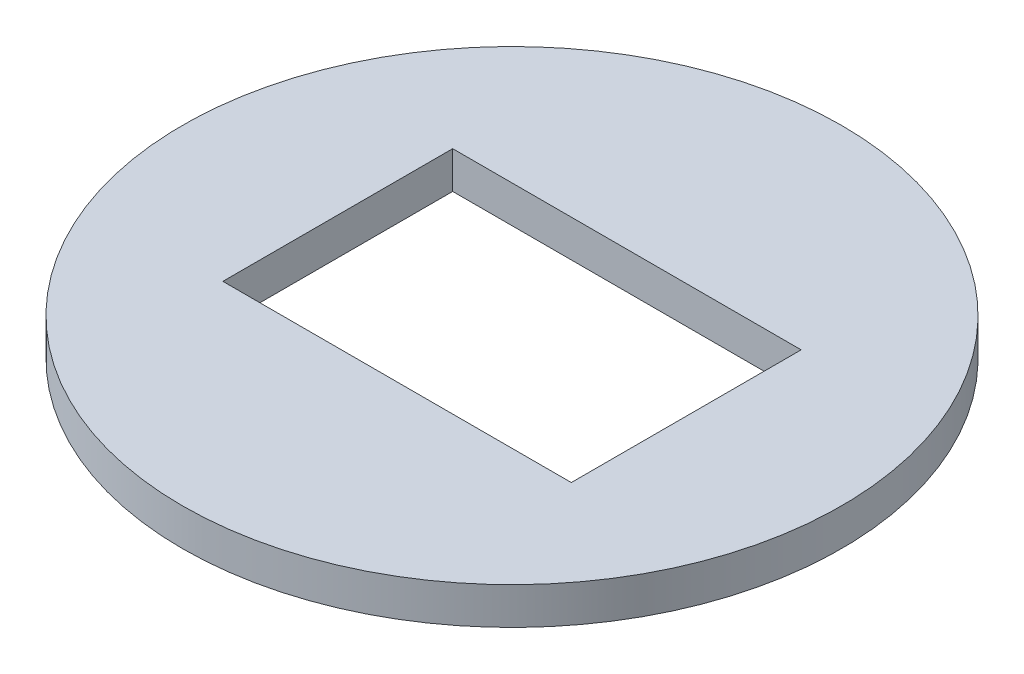
ISO-10303-21;
HEADER;
FILE_DESCRIPTION(('STEP AP214'),'2;1');
FILE_NAME('part.step','',(''),(''),'','','');
FILE_SCHEMA(('AUTOMOTIVE_DESIGN { 1 0 10303 214 1 1 1 1 }'));
ENDSEC;
DATA;
#1=APPLICATION_CONTEXT('core data for automotive mechanical design processes');
#2=APPLICATION_PROTOCOL_DEFINITION('international standard','automotive_design',2000,#1);
#3=PRODUCT_CONTEXT('',#1,'mechanical');
#4=PRODUCT('Part','Part','',(#3));
#5=PRODUCT_RELATED_PRODUCT_CATEGORY('part','',(#4));
#6=PRODUCT_DEFINITION_FORMATION('','',#4);
#7=PRODUCT_DEFINITION_CONTEXT('part definition',#1,'design');
#8=PRODUCT_DEFINITION('design','',#6,#7);
#9=PRODUCT_DEFINITION_SHAPE('','',#8);
#10=(LENGTH_UNIT() NAMED_UNIT(*) SI_UNIT(.MILLI.,.METRE.));
#11=(NAMED_UNIT(*) PLANE_ANGLE_UNIT() SI_UNIT($,.RADIAN.));
#12=(NAMED_UNIT(*) SI_UNIT($,.STERADIAN.) SOLID_ANGLE_UNIT());
#13=UNCERTAINTY_MEASURE_WITH_UNIT(LENGTH_MEASURE(1.E-05),#10,'distance_accuracy_value','');
#14=(GEOMETRIC_REPRESENTATION_CONTEXT(3) GLOBAL_UNCERTAINTY_ASSIGNED_CONTEXT((#13)) GLOBAL_UNIT_ASSIGNED_CONTEXT((#10,
#11,#12)) REPRESENTATION_CONTEXT('',''));
#15=CARTESIAN_POINT('',(0.,0.,0.));
#16=DIRECTION('',(0.,0.,1.));
#17=DIRECTION('',(1.,0.,0.));
#18=AXIS2_PLACEMENT_3D('',#15,#16,#17);
#19=CARTESIAN_POINT('',(0.,10.,0.));
#20=DIRECTION('',(0.,-1.,0.));
#21=DIRECTION('',(0.,0.,-1.));
#22=AXIS2_PLACEMENT_3D('',#19,#20,#21);
#23=CYLINDRICAL_SURFACE('',#22,88.9);
#24=CARTESIAN_POINT('',(0.,10.,0.));
#25=DIRECTION('',(0.,1.,0.));
#26=DIRECTION('',(0.,0.,1.));
#27=AXIS2_PLACEMENT_3D('',#24,#25,#26);
#28=CIRCLE('',#27,88.9);
#29=CARTESIAN_POINT('',(0.,10.,88.9));
#30=VERTEX_POINT('',#29);
#31=EDGE_CURVE('E91',#30,#30,#28,.T.);
#32=ORIENTED_EDGE('',*,*,#31,.F.);
#33=EDGE_LOOP('',(#32));
#34=FACE_BOUND('',#33,.T.);
#35=CARTESIAN_POINT('',(0.,0.,0.));
#36=DIRECTION('',(0.,1.,0.));
#37=DIRECTION('',(0.,0.,1.));
#38=AXIS2_PLACEMENT_3D('',#35,#36,#37);
#39=CIRCLE('',#38,88.9);
#40=CARTESIAN_POINT('',(0.,0.,88.9));
#41=VERTEX_POINT('',#40);
#42=EDGE_CURVE('E88',#41,#41,#39,.T.);
#43=ORIENTED_EDGE('',*,*,#42,.T.);
#44=EDGE_LOOP('',(#43));
#45=FACE_BOUND('',#44,.T.);
#46=ADVANCED_FACE('F32',(#34,#45),#23,.T.);
#47=CARTESIAN_POINT('',(0.,10.,0.));
#48=DIRECTION('',(0.,1.,0.));
#49=DIRECTION('',(0.,0.,1.));
#50=AXIS2_PLACEMENT_3D('',#47,#48,#49);
#51=PLANE('',#50);
#52=DIRECTION('',(0.,0.,-1.));
#53=VECTOR('',#52,1.);
#54=CARTESIAN_POINT('',(47.,10.,0.));
#55=LINE('',#54,#53);
#56=CARTESIAN_POINT('',(47.,10.,31.));
#57=VERTEX_POINT('',#56);
#58=CARTESIAN_POINT('',(47.,10.,-31.));
#59=VERTEX_POINT('',#58);
#60=EDGE_CURVE('E80',#57,#59,#55,.T.);
#61=ORIENTED_EDGE('',*,*,#60,.F.);
#62=DIRECTION('',(1.,0.,0.));
#63=VECTOR('',#62,1.);
#64=CARTESIAN_POINT('',(0.,10.,31.));
#65=LINE('',#64,#63);
#66=CARTESIAN_POINT('',(-47.,10.,31.));
#67=VERTEX_POINT('',#66);
#68=EDGE_CURVE('E69',#67,#57,#65,.T.);
#69=ORIENTED_EDGE('',*,*,#68,.F.);
#70=DIRECTION('',(0.,0.,1.));
#71=VECTOR('',#70,1.);
#72=CARTESIAN_POINT('',(-47.,10.,0.));
#73=LINE('',#72,#71);
#74=CARTESIAN_POINT('',(-47.,10.,-31.));
#75=VERTEX_POINT('',#74);
#76=EDGE_CURVE('E74',#75,#67,#73,.T.);
#77=ORIENTED_EDGE('',*,*,#76,.F.);
#78=DIRECTION('',(-1.,0.,0.));
#79=VECTOR('',#78,1.);
#80=CARTESIAN_POINT('',(0.,10.,-31.));
#81=LINE('',#80,#79);
#82=EDGE_CURVE('E87',#59,#75,#81,.T.);
#83=ORIENTED_EDGE('',*,*,#82,.F.);
#84=EDGE_LOOP('',(#61,#69,#77,#83));
#85=FACE_BOUND('',#84,.T.);
#86=ORIENTED_EDGE('',*,*,#31,.T.);
#87=EDGE_LOOP('',(#86));
#88=FACE_BOUND('',#87,.T.);
#89=ADVANCED_FACE('F85',(#85,#88),#51,.T.);
#90=CARTESIAN_POINT('',(0.,0.,0.));
#91=DIRECTION('',(0.,1.,0.));
#92=DIRECTION('',(0.,0.,1.));
#93=AXIS2_PLACEMENT_3D('',#90,#91,#92);
#94=PLANE('',#93);
#95=DIRECTION('',(1.,0.,0.));
#96=VECTOR('',#95,1.);
#97=CARTESIAN_POINT('',(0.,0.,31.));
#98=LINE('',#97,#96);
#99=CARTESIAN_POINT('',(-47.,0.,31.));
#100=VERTEX_POINT('',#99);
#101=CARTESIAN_POINT('',(47.,0.,31.));
#102=VERTEX_POINT('',#101);
#103=EDGE_CURVE('E97',#100,#102,#98,.T.);
#104=ORIENTED_EDGE('',*,*,#103,.T.);
#105=DIRECTION('',(0.,0.,-1.));
#106=VECTOR('',#105,1.);
#107=CARTESIAN_POINT('',(47.,0.,0.));
#108=LINE('',#107,#106);
#109=CARTESIAN_POINT('',(47.,0.,-31.));
#110=VERTEX_POINT('',#109);
#111=EDGE_CURVE('E11',#102,#110,#108,.T.);
#112=ORIENTED_EDGE('',*,*,#111,.T.);
#113=DIRECTION('',(-1.,0.,0.));
#114=VECTOR('',#113,1.);
#115=CARTESIAN_POINT('',(0.,0.,-31.));
#116=LINE('',#115,#114);
#117=CARTESIAN_POINT('',(-47.,0.,-31.));
#118=VERTEX_POINT('',#117);
#119=EDGE_CURVE('E39',#110,#118,#116,.T.);
#120=ORIENTED_EDGE('',*,*,#119,.T.);
#121=DIRECTION('',(0.,0.,1.));
#122=VECTOR('',#121,1.);
#123=CARTESIAN_POINT('',(-47.,0.,0.));
#124=LINE('',#123,#122);
#125=EDGE_CURVE('E100',#118,#100,#124,.T.);
#126=ORIENTED_EDGE('',*,*,#125,.T.);
#127=EDGE_LOOP('',(#104,#112,#120,#126));
#128=FACE_BOUND('',#127,.T.);
#129=ORIENTED_EDGE('',*,*,#42,.F.);
#130=EDGE_LOOP('',(#129));
#131=FACE_BOUND('',#130,.T.);
#132=ADVANCED_FACE('F104',(#128,#131),#94,.F.);
#133=CARTESIAN_POINT('',(47.,20.,31.));
#134=DIRECTION('',(1.,0.,0.));
#135=DIRECTION('',(0.,0.,-1.));
#136=AXIS2_PLACEMENT_3D('',#133,#134,#135);
#137=PLANE('',#136);
#138=ORIENTED_EDGE('',*,*,#60,.T.);
#139=DIRECTION('',(0.,-1.,0.));
#140=VECTOR('',#139,1.);
#141=CARTESIAN_POINT('',(47.,20.,-31.));
#142=LINE('',#141,#140);
#143=EDGE_CURVE('E75',#59,#110,#142,.T.);
#144=ORIENTED_EDGE('',*,*,#143,.T.);
#145=ORIENTED_EDGE('',*,*,#111,.F.);
#146=DIRECTION('',(0.,-1.,0.));
#147=VECTOR('',#146,1.);
#148=CARTESIAN_POINT('',(47.,20.,31.));
#149=LINE('',#148,#147);
#150=EDGE_CURVE('E51',#57,#102,#149,.T.);
#151=ORIENTED_EDGE('',*,*,#150,.F.);
#152=EDGE_LOOP('',(#138,#144,#145,#151));
#153=FACE_BOUND('',#152,.T.);
#154=ADVANCED_FACE('F78',(#153),#137,.F.);
#155=CARTESIAN_POINT('',(-47.,20.,-31.));
#156=DIRECTION('',(0.,0.,-1.));
#157=DIRECTION('',(-1.,0.,0.));
#158=AXIS2_PLACEMENT_3D('',#155,#156,#157);
#159=PLANE('',#158);
#160=ORIENTED_EDGE('',*,*,#82,.T.);
#161=DIRECTION('',(0.,-1.,0.));
#162=VECTOR('',#161,1.);
#163=CARTESIAN_POINT('',(-47.,20.,-31.));
#164=LINE('',#163,#162);
#165=EDGE_CURVE('E110',#75,#118,#164,.T.);
#166=ORIENTED_EDGE('',*,*,#165,.T.);
#167=ORIENTED_EDGE('',*,*,#119,.F.);
#168=ORIENTED_EDGE('',*,*,#143,.F.);
#169=EDGE_LOOP('',(#160,#166,#167,#168));
#170=FACE_BOUND('',#169,.T.);
#171=ADVANCED_FACE('F108',(#170),#159,.F.);
#172=CARTESIAN_POINT('',(-47.,20.,31.));
#173=DIRECTION('',(-1.,0.,0.));
#174=DIRECTION('',(0.,0.,1.));
#175=AXIS2_PLACEMENT_3D('',#172,#173,#174);
#176=PLANE('',#175);
#177=ORIENTED_EDGE('',*,*,#76,.T.);
#178=DIRECTION('',(0.,-1.,0.));
#179=VECTOR('',#178,1.);
#180=CARTESIAN_POINT('',(-47.,20.,31.));
#181=LINE('',#180,#179);
#182=EDGE_CURVE('E46',#67,#100,#181,.T.);
#183=ORIENTED_EDGE('',*,*,#182,.T.);
#184=ORIENTED_EDGE('',*,*,#125,.F.);
#185=ORIENTED_EDGE('',*,*,#165,.F.);
#186=EDGE_LOOP('',(#177,#183,#184,#185));
#187=FACE_BOUND('',#186,.T.);
#188=ADVANCED_FACE('F115',(#187),#176,.F.);
#189=CARTESIAN_POINT('',(-47.,20.,31.));
#190=DIRECTION('',(0.,0.,1.));
#191=DIRECTION('',(1.,0.,0.));
#192=AXIS2_PLACEMENT_3D('',#189,#190,#191);
#193=PLANE('',#192);
#194=ORIENTED_EDGE('',*,*,#68,.T.);
#195=ORIENTED_EDGE('',*,*,#150,.T.);
#196=ORIENTED_EDGE('',*,*,#103,.F.);
#197=ORIENTED_EDGE('',*,*,#182,.F.);
#198=EDGE_LOOP('',(#194,#195,#196,#197));
#199=FACE_BOUND('',#198,.T.);
#200=ADVANCED_FACE('F70',(#199),#193,.F.);
#201=CLOSED_SHELL('',(#46,#89,#132,#154,#171,#188,#200));
#202=MANIFOLD_SOLID_BREP('B2',#201);
#203=ADVANCED_BREP_SHAPE_REPRESENTATION('',(#18,#202),#14);
#204=SHAPE_DEFINITION_REPRESENTATION(#9,#203);
ENDSEC;
END-ISO-10303-21;
